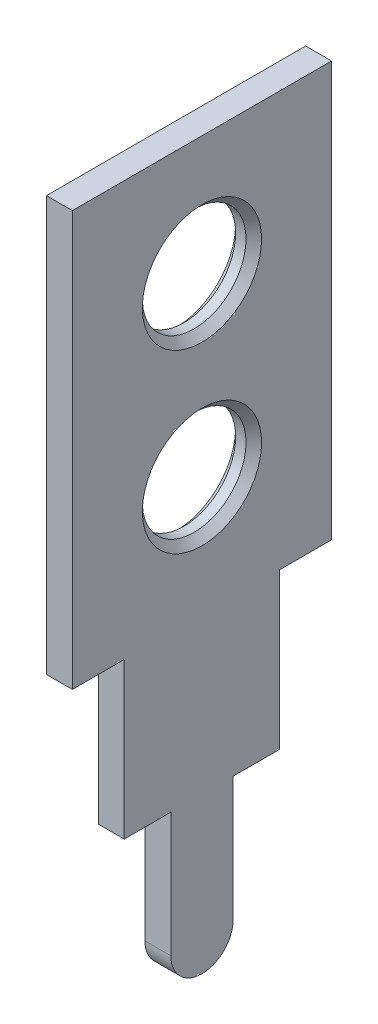
ISO-10303-21;
HEADER;
FILE_DESCRIPTION(('STEP AP214'),'2;1');
FILE_NAME('part.step','',(''),(''),'','','');
FILE_SCHEMA(('AUTOMOTIVE_DESIGN { 1 0 10303 214 1 1 1 1 }'));
ENDSEC;
DATA;
#1=APPLICATION_CONTEXT('core data for automotive mechanical design processes');
#2=APPLICATION_PROTOCOL_DEFINITION('international standard','automotive_design',2000,#1);
#3=PRODUCT_CONTEXT('',#1,'mechanical');
#4=PRODUCT('Part','Part','',(#3));
#5=PRODUCT_RELATED_PRODUCT_CATEGORY('part','',(#4));
#6=PRODUCT_DEFINITION_FORMATION('','',#4);
#7=PRODUCT_DEFINITION_CONTEXT('part definition',#1,'design');
#8=PRODUCT_DEFINITION('design','',#6,#7);
#9=PRODUCT_DEFINITION_SHAPE('','',#8);
#10=(LENGTH_UNIT() NAMED_UNIT(*) SI_UNIT(.MILLI.,.METRE.));
#11=(NAMED_UNIT(*) PLANE_ANGLE_UNIT() SI_UNIT($,.RADIAN.));
#12=(NAMED_UNIT(*) SI_UNIT($,.STERADIAN.) SOLID_ANGLE_UNIT());
#13=UNCERTAINTY_MEASURE_WITH_UNIT(LENGTH_MEASURE(1.E-05),#10,'distance_accuracy_value','');
#14=(GEOMETRIC_REPRESENTATION_CONTEXT(3) GLOBAL_UNCERTAINTY_ASSIGNED_CONTEXT((#13)) GLOBAL_UNIT_ASSIGNED_CONTEXT((#10,
#11,#12)) REPRESENTATION_CONTEXT('',''));
#15=CARTESIAN_POINT('',(0.,0.,0.));
#16=DIRECTION('',(0.,0.,1.));
#17=DIRECTION('',(1.,0.,0.));
#18=AXIS2_PLACEMENT_3D('',#15,#16,#17);
#19=CARTESIAN_POINT('',(-0.249999999880401,8.7,0.));
#20=DIRECTION('',(-1.,0.,0.));
#21=DIRECTION('',(0.,0.,1.));
#22=AXIS2_PLACEMENT_3D('',#19,#20,#21);
#23=CONICAL_SURFACE('',#22,1.1499999999387,0.785398163397448);
#24=CARTESIAN_POINT('',(-0.0999999999999957,8.7,0.));
#25=DIRECTION('',(1.,0.,0.));
#26=DIRECTION('',(0.,0.,-1.));
#27=AXIS2_PLACEMENT_3D('',#24,#25,#26);
#28=CIRCLE('',#27,1.);
#29=CARTESIAN_POINT('',(-0.0999999999999957,8.7,-1.));
#30=VERTEX_POINT('',#29);
#31=EDGE_CURVE('E281',#30,#30,#28,.T.);
#32=ORIENTED_EDGE('',*,*,#31,.T.);
#33=EDGE_LOOP('',(#32));
#34=FACE_BOUND('',#33,.T.);
#35=CARTESIAN_POINT('',(-0.249999999994088,8.7,0.));
#36=DIRECTION('',(-1.,0.,0.));
#37=DIRECTION('',(0.,0.,1.));
#38=AXIS2_PLACEMENT_3D('',#35,#36,#37);
#39=CIRCLE('',#38,1.15000000005239);
#40=CARTESIAN_POINT('',(-0.249999999994088,8.7,1.15000000005239));
#41=VERTEX_POINT('',#40);
#42=EDGE_CURVE('E20',#41,#41,#39,.F.);
#43=ORIENTED_EDGE('',*,*,#42,.F.);
#44=EDGE_LOOP('',(#43));
#45=FACE_BOUND('',#44,.T.);
#46=ADVANCED_FACE('F17',(#34,#45),#23,.F.);
#47=CARTESIAN_POINT('',(-0.250000000050932,5.3,0.));
#48=DIRECTION('',(-1.,0.,0.));
#49=DIRECTION('',(0.,0.,1.));
#50=AXIS2_PLACEMENT_3D('',#47,#48,#49);
#51=CONICAL_SURFACE('',#50,1.14999999999554,0.78539816320797);
#52=CARTESIAN_POINT('',(-0.100000000000003,5.3,0.));
#53=DIRECTION('',(1.,0.,0.));
#54=DIRECTION('',(0.,0.,-1.));
#55=AXIS2_PLACEMENT_3D('',#52,#53,#54);
#56=CIRCLE('',#55,1.);
#57=CARTESIAN_POINT('',(-0.100000000000003,5.3,-1.));
#58=VERTEX_POINT('',#57);
#59=EDGE_CURVE('E284',#58,#58,#56,.T.);
#60=ORIENTED_EDGE('',*,*,#59,.T.);
#61=EDGE_LOOP('',(#60));
#62=FACE_BOUND('',#61,.T.);
#63=CARTESIAN_POINT('',(-0.250000000050932,5.3,0.));
#64=DIRECTION('',(-1.,0.,0.));
#65=DIRECTION('',(0.,0.,1.));
#66=AXIS2_PLACEMENT_3D('',#63,#64,#65);
#67=CIRCLE('',#66,1.14999999999554);
#68=CARTESIAN_POINT('',(-0.250000000050932,5.3,1.14999999999554));
#69=VERTEX_POINT('',#68);
#70=EDGE_CURVE('E280',#69,#69,#67,.F.);
#71=ORIENTED_EDGE('',*,*,#70,.F.);
#72=EDGE_LOOP('',(#71));
#73=FACE_BOUND('',#72,.T.);
#74=ADVANCED_FACE('F298',(#62,#73),#51,.F.);
#75=CARTESIAN_POINT('',(-0.25,5.3,0.));
#76=DIRECTION('',(1.,0.,0.));
#77=DIRECTION('',(0.,0.,-1.));
#78=AXIS2_PLACEMENT_3D('',#75,#76,#77);
#79=CYLINDRICAL_SURFACE('',#78,1.);
#80=CARTESIAN_POINT('',(0.0999999999748979,5.3,0.));
#81=DIRECTION('',(1.,0.,0.));
#82=DIRECTION('',(0.,0.,-1.));
#83=AXIS2_PLACEMENT_3D('',#80,#81,#82);
#84=CIRCLE('',#83,0.999999999976353);
#85=CARTESIAN_POINT('',(0.0999999999748979,5.3,-0.999999999976353));
#86=VERTEX_POINT('',#85);
#87=EDGE_CURVE('E277',#86,#86,#84,.T.);
#88=ORIENTED_EDGE('',*,*,#87,.T.);
#89=EDGE_LOOP('',(#88));
#90=FACE_BOUND('',#89,.T.);
#91=ORIENTED_EDGE('',*,*,#59,.F.);
#92=EDGE_LOOP('',(#91));
#93=FACE_BOUND('',#92,.T.);
#94=ADVANCED_FACE('F304',(#90,#93),#79,.F.);
#95=CARTESIAN_POINT('',(-0.25,8.7,0.));
#96=DIRECTION('',(1.,0.,0.));
#97=DIRECTION('',(0.,0.,-1.));
#98=AXIS2_PLACEMENT_3D('',#95,#96,#97);
#99=CYLINDRICAL_SURFACE('',#98,1.);
#100=CARTESIAN_POINT('',(0.100000000031741,8.7,0.));
#101=DIRECTION('',(1.,0.,0.));
#102=DIRECTION('',(0.,0.,-1.));
#103=AXIS2_PLACEMENT_3D('',#100,#101,#102);
#104=CIRCLE('',#103,0.999999999976353);
#105=CARTESIAN_POINT('',(0.100000000031741,8.7,-0.999999999976353));
#106=VERTEX_POINT('',#105);
#107=EDGE_CURVE('E242',#106,#106,#104,.T.);
#108=ORIENTED_EDGE('',*,*,#107,.T.);
#109=EDGE_LOOP('',(#108));
#110=FACE_BOUND('',#109,.T.);
#111=ORIENTED_EDGE('',*,*,#31,.F.);
#112=EDGE_LOOP('',(#111));
#113=FACE_BOUND('',#112,.T.);
#114=ADVANCED_FACE('F364',(#110,#113),#99,.F.);
#115=CARTESIAN_POINT('',(-0.25,-2.4,0.));
#116=DIRECTION('',(-1.,0.,0.));
#117=DIRECTION('',(0.,0.,1.));
#118=AXIS2_PLACEMENT_3D('',#115,#116,#117);
#119=PLANE('',#118);
#120=DIRECTION('',(0.,0.,1.));
#121=VECTOR('',#120,1.);
#122=CARTESIAN_POINT('',(-0.25,0.,-0.600000000000003));
#123=LINE('',#122,#121);
#124=CARTESIAN_POINT('',(-0.25,0.,-1.5));
#125=VERTEX_POINT('',#124);
#126=CARTESIAN_POINT('',(-0.25,0.,-0.599999999999994));
#127=VERTEX_POINT('',#126);
#128=EDGE_CURVE('E62',#125,#127,#123,.T.);
#129=ORIENTED_EDGE('',*,*,#128,.T.);
#130=DIRECTION('',(0.,-1.,0.));
#131=VECTOR('',#130,1.);
#132=CARTESIAN_POINT('',(-0.25,-2.4,-0.599999999999989));
#133=LINE('',#132,#131);
#134=CARTESIAN_POINT('',(-0.25,-2.4,-0.599999999999995));
#135=VERTEX_POINT('',#134);
#136=EDGE_CURVE('E150',#127,#135,#133,.T.);
#137=ORIENTED_EDGE('',*,*,#136,.T.);
#138=CARTESIAN_POINT('',(-0.25,-2.4,0.));
#139=DIRECTION('',(-1.,0.,0.));
#140=DIRECTION('',(0.,0.,1.));
#141=AXIS2_PLACEMENT_3D('',#138,#139,#140);
#142=CIRCLE('',#141,0.600000000000001);
#143=CARTESIAN_POINT('',(-0.25,-2.4,0.600000000000002));
#144=VERTEX_POINT('',#143);
#145=EDGE_CURVE('E145',#144,#135,#142,.F.);
#146=ORIENTED_EDGE('',*,*,#145,.F.);
#147=DIRECTION('',(0.,1.,0.));
#148=VECTOR('',#147,1.);
#149=CARTESIAN_POINT('',(-0.25,-2.4,0.600000000000003));
#150=LINE('',#149,#148);
#151=CARTESIAN_POINT('',(-0.25,0.,0.600000000000003));
#152=VERTEX_POINT('',#151);
#153=EDGE_CURVE('E53',#144,#152,#150,.T.);
#154=ORIENTED_EDGE('',*,*,#153,.T.);
#155=DIRECTION('',(0.,0.,1.));
#156=VECTOR('',#155,1.);
#157=CARTESIAN_POINT('',(-0.25,0.,0.600000000000003));
#158=LINE('',#157,#156);
#159=CARTESIAN_POINT('',(-0.25,0.,1.5));
#160=VERTEX_POINT('',#159);
#161=EDGE_CURVE('E118',#152,#160,#158,.T.);
#162=ORIENTED_EDGE('',*,*,#161,.T.);
#163=DIRECTION('',(0.,1.,0.));
#164=VECTOR('',#163,1.);
#165=CARTESIAN_POINT('',(-0.25,0.,1.5));
#166=LINE('',#165,#164);
#167=CARTESIAN_POINT('',(-0.25,3.,1.5));
#168=VERTEX_POINT('',#167);
#169=EDGE_CURVE('E227',#160,#168,#166,.T.);
#170=ORIENTED_EDGE('',*,*,#169,.T.);
#171=DIRECTION('',(0.,0.,1.));
#172=VECTOR('',#171,1.);
#173=CARTESIAN_POINT('',(-0.25,3.,1.5));
#174=LINE('',#173,#172);
#175=CARTESIAN_POINT('',(-0.25,3.,2.5));
#176=VERTEX_POINT('',#175);
#177=EDGE_CURVE('E217',#168,#176,#174,.T.);
#178=ORIENTED_EDGE('',*,*,#177,.T.);
#179=DIRECTION('',(0.,1.,0.));
#180=VECTOR('',#179,1.);
#181=CARTESIAN_POINT('',(-0.25,3.,2.5));
#182=LINE('',#181,#180);
#183=CARTESIAN_POINT('',(-0.25,11.,2.5));
#184=VERTEX_POINT('',#183);
#185=EDGE_CURVE('E206',#176,#184,#182,.T.);
#186=ORIENTED_EDGE('',*,*,#185,.T.);
#187=DIRECTION('',(0.,0.,1.));
#188=VECTOR('',#187,1.);
#189=CARTESIAN_POINT('',(-0.25,11.,-2.5));
#190=LINE('',#189,#188);
#191=CARTESIAN_POINT('',(-0.25,11.,-2.5));
#192=VERTEX_POINT('',#191);
#193=EDGE_CURVE('E195',#184,#192,#190,.F.);
#194=ORIENTED_EDGE('',*,*,#193,.T.);
#195=DIRECTION('',(0.,1.,0.));
#196=VECTOR('',#195,1.);
#197=CARTESIAN_POINT('',(-0.25,3.,-2.5));
#198=LINE('',#197,#196);
#199=CARTESIAN_POINT('',(-0.25,3.,-2.5));
#200=VERTEX_POINT('',#199);
#201=EDGE_CURVE('E184',#192,#200,#198,.F.);
#202=ORIENTED_EDGE('',*,*,#201,.T.);
#203=DIRECTION('',(0.,0.,1.));
#204=VECTOR('',#203,1.);
#205=CARTESIAN_POINT('',(-0.25,3.,-1.5));
#206=LINE('',#205,#204);
#207=CARTESIAN_POINT('',(-0.25,3.,-1.5));
#208=VERTEX_POINT('',#207);
#209=EDGE_CURVE('E173',#200,#208,#206,.T.);
#210=ORIENTED_EDGE('',*,*,#209,.T.);
#211=DIRECTION('',(0.,1.,0.));
#212=VECTOR('',#211,1.);
#213=CARTESIAN_POINT('',(-0.25,0.,-1.5));
#214=LINE('',#213,#212);
#215=EDGE_CURVE('E162',#208,#125,#214,.F.);
#216=ORIENTED_EDGE('',*,*,#215,.T.);
#217=EDGE_LOOP('',(#129,#137,#146,#154,#162,#170,#178,#186,#194,#202,#210,#216));
#218=FACE_BOUND('',#217,.T.);
#219=ORIENTED_EDGE('',*,*,#70,.T.);
#220=EDGE_LOOP('',(#219));
#221=FACE_BOUND('',#220,.T.);
#222=ORIENTED_EDGE('',*,*,#42,.T.);
#223=EDGE_LOOP('',(#222));
#224=FACE_BOUND('',#223,.T.);
#225=ADVANCED_FACE('F295',(#218,#221,#224),#119,.T.);
#226=CARTESIAN_POINT('',(0.249999999937245,5.3,0.));
#227=DIRECTION('',(1.,0.,0.));
#228=DIRECTION('',(0.,0.,-1.));
#229=AXIS2_PLACEMENT_3D('',#226,#227,#228);
#230=CONICAL_SURFACE('',#229,1.14999999999554,0.785398163586926);
#231=CARTESIAN_POINT('',(0.249999999937245,5.3,0.));
#232=DIRECTION('',(1.,0.,0.));
#233=DIRECTION('',(0.,0.,-1.));
#234=AXIS2_PLACEMENT_3D('',#231,#232,#233);
#235=CIRCLE('',#234,1.14999999999554);
#236=CARTESIAN_POINT('',(0.249999999937245,5.3,-1.14999999999554));
#237=VERTEX_POINT('',#236);
#238=EDGE_CURVE('E136',#237,#237,#235,.T.);
#239=ORIENTED_EDGE('',*,*,#238,.T.);
#240=EDGE_LOOP('',(#239));
#241=FACE_BOUND('',#240,.T.);
#242=ORIENTED_EDGE('',*,*,#87,.F.);
#243=EDGE_LOOP('',(#242));
#244=FACE_BOUND('',#243,.T.);
#245=ADVANCED_FACE('F357',(#241,#244),#230,.F.);
#246=CARTESIAN_POINT('',(0.249999999994088,8.7,0.));
#247=DIRECTION('',(1.,0.,0.));
#248=DIRECTION('',(0.,0.,-1.));
#249=AXIS2_PLACEMENT_3D('',#246,#247,#248);
#250=CONICAL_SURFACE('',#249,1.14999999999554,0.785398163586926);
#251=CARTESIAN_POINT('',(0.249999999994088,8.7,0.));
#252=DIRECTION('',(1.,0.,0.));
#253=DIRECTION('',(0.,0.,-1.));
#254=AXIS2_PLACEMENT_3D('',#251,#252,#253);
#255=CIRCLE('',#254,1.14999999999554);
#256=CARTESIAN_POINT('',(0.249999999994088,8.7,-1.14999999999554));
#257=VERTEX_POINT('',#256);
#258=EDGE_CURVE('E133',#257,#257,#255,.T.);
#259=ORIENTED_EDGE('',*,*,#258,.T.);
#260=EDGE_LOOP('',(#259));
#261=FACE_BOUND('',#260,.T.);
#262=ORIENTED_EDGE('',*,*,#107,.F.);
#263=EDGE_LOOP('',(#262));
#264=FACE_BOUND('',#263,.T.);
#265=ADVANCED_FACE('F354',(#261,#264),#250,.F.);
#266=CARTESIAN_POINT('',(0.25,-2.4,0.600000000000003));
#267=DIRECTION('',(0.,0.,-1.));
#268=DIRECTION('',(0.,1.,0.));
#269=AXIS2_PLACEMENT_3D('',#266,#267,#268);
#270=PLANE('',#269);
#271=DIRECTION('',(-1.,0.,0.));
#272=VECTOR('',#271,1.);
#273=CARTESIAN_POINT('',(0.25,-2.4,0.600000000000001));
#274=LINE('',#273,#272);
#275=CARTESIAN_POINT('',(0.25,-2.4,0.600000000000002));
#276=VERTEX_POINT('',#275);
#277=EDGE_CURVE('E132',#276,#144,#274,.T.);
#278=ORIENTED_EDGE('',*,*,#277,.F.);
#279=DIRECTION('',(0.,1.,0.));
#280=VECTOR('',#279,1.);
#281=CARTESIAN_POINT('',(0.25,-2.4,0.600000000000003));
#282=LINE('',#281,#280);
#283=CARTESIAN_POINT('',(0.25,0.,0.600000000000003));
#284=VERTEX_POINT('',#283);
#285=EDGE_CURVE('E126',#276,#284,#282,.T.);
#286=ORIENTED_EDGE('',*,*,#285,.T.);
#287=DIRECTION('',(-1.,0.,0.));
#288=VECTOR('',#287,1.);
#289=CARTESIAN_POINT('',(0.25,0.,0.600000000000003));
#290=LINE('',#289,#288);
#291=EDGE_CURVE('E113',#284,#152,#290,.T.);
#292=ORIENTED_EDGE('',*,*,#291,.T.);
#293=ORIENTED_EDGE('',*,*,#153,.F.);
#294=EDGE_LOOP('',(#278,#286,#292,#293));
#295=FACE_BOUND('',#294,.T.);
#296=ADVANCED_FACE('F131',(#295),#270,.F.);
#297=CARTESIAN_POINT('',(0.25,0.,0.600000000000003));
#298=DIRECTION('',(0.,1.,0.));
#299=DIRECTION('',(-1.,0.,0.));
#300=AXIS2_PLACEMENT_3D('',#297,#298,#299);
#301=PLANE('',#300);
#302=ORIENTED_EDGE('',*,*,#291,.F.);
#303=DIRECTION('',(0.,0.,1.));
#304=VECTOR('',#303,1.);
#305=CARTESIAN_POINT('',(0.25,0.,0.));
#306=LINE('',#305,#304);
#307=CARTESIAN_POINT('',(0.25,0.,1.5));
#308=VERTEX_POINT('',#307);
#309=EDGE_CURVE('E117',#284,#308,#306,.T.);
#310=ORIENTED_EDGE('',*,*,#309,.T.);
#311=DIRECTION('',(-1.,0.,0.));
#312=VECTOR('',#311,1.);
#313=CARTESIAN_POINT('',(0.25,0.,1.5));
#314=LINE('',#313,#312);
#315=EDGE_CURVE('E233',#308,#160,#314,.T.);
#316=ORIENTED_EDGE('',*,*,#315,.T.);
#317=ORIENTED_EDGE('',*,*,#161,.F.);
#318=EDGE_LOOP('',(#302,#310,#316,#317));
#319=FACE_BOUND('',#318,.T.);
#320=ADVANCED_FACE('F115',(#319),#301,.F.);
#321=CARTESIAN_POINT('',(0.25,0.,1.5));
#322=DIRECTION('',(0.,0.,-1.));
#323=DIRECTION('',(-1.,0.,0.));
#324=AXIS2_PLACEMENT_3D('',#321,#322,#323);
#325=PLANE('',#324);
#326=ORIENTED_EDGE('',*,*,#315,.F.);
#327=DIRECTION('',(0.,1.,0.));
#328=VECTOR('',#327,1.);
#329=CARTESIAN_POINT('',(0.25,-2.4,1.5));
#330=LINE('',#329,#328);
#331=CARTESIAN_POINT('',(0.25,3.,1.5));
#332=VERTEX_POINT('',#331);
#333=EDGE_CURVE('E129',#308,#332,#330,.T.);
#334=ORIENTED_EDGE('',*,*,#333,.T.);
#335=DIRECTION('',(1.,0.,0.));
#336=VECTOR('',#335,1.);
#337=CARTESIAN_POINT('',(0.25,3.,1.5));
#338=LINE('',#337,#336);
#339=EDGE_CURVE('E224',#332,#168,#338,.F.);
#340=ORIENTED_EDGE('',*,*,#339,.T.);
#341=ORIENTED_EDGE('',*,*,#169,.F.);
#342=EDGE_LOOP('',(#326,#334,#340,#341));
#343=FACE_BOUND('',#342,.T.);
#344=ADVANCED_FACE('F345',(#343),#325,.F.);
#345=CARTESIAN_POINT('',(0.25,3.,1.5));
#346=DIRECTION('',(0.,1.,0.));
#347=DIRECTION('',(0.,0.,1.));
#348=AXIS2_PLACEMENT_3D('',#345,#346,#347);
#349=PLANE('',#348);
#350=ORIENTED_EDGE('',*,*,#339,.F.);
#351=DIRECTION('',(0.,0.,1.));
#352=VECTOR('',#351,1.);
#353=CARTESIAN_POINT('',(0.25,3.,0.));
#354=LINE('',#353,#352);
#355=CARTESIAN_POINT('',(0.25,3.,2.5));
#356=VERTEX_POINT('',#355);
#357=EDGE_CURVE('E211',#332,#356,#354,.T.);
#358=ORIENTED_EDGE('',*,*,#357,.T.);
#359=DIRECTION('',(1.,0.,0.));
#360=VECTOR('',#359,1.);
#361=CARTESIAN_POINT('',(0.25,3.,2.5));
#362=LINE('',#361,#360);
#363=EDGE_CURVE('E214',#356,#176,#362,.F.);
#364=ORIENTED_EDGE('',*,*,#363,.T.);
#365=ORIENTED_EDGE('',*,*,#177,.F.);
#366=EDGE_LOOP('',(#350,#358,#364,#365));
#367=FACE_BOUND('',#366,.T.);
#368=ADVANCED_FACE('F341',(#367),#349,.F.);
#369=CARTESIAN_POINT('',(0.25,3.,2.5));
#370=DIRECTION('',(0.,0.,-1.));
#371=DIRECTION('',(0.,1.,0.));
#372=AXIS2_PLACEMENT_3D('',#369,#370,#371);
#373=PLANE('',#372);
#374=ORIENTED_EDGE('',*,*,#363,.F.);
#375=DIRECTION('',(0.,1.,0.));
#376=VECTOR('',#375,1.);
#377=CARTESIAN_POINT('',(0.25,-2.4,2.5));
#378=LINE('',#377,#376);
#379=CARTESIAN_POINT('',(0.25,11.,2.5));
#380=VERTEX_POINT('',#379);
#381=EDGE_CURVE('E200',#356,#380,#378,.T.);
#382=ORIENTED_EDGE('',*,*,#381,.T.);
#383=DIRECTION('',(1.,0.,0.));
#384=VECTOR('',#383,1.);
#385=CARTESIAN_POINT('',(0.25,11.,2.5));
#386=LINE('',#385,#384);
#387=EDGE_CURVE('E203',#380,#184,#386,.F.);
#388=ORIENTED_EDGE('',*,*,#387,.T.);
#389=ORIENTED_EDGE('',*,*,#185,.F.);
#390=EDGE_LOOP('',(#374,#382,#388,#389));
#391=FACE_BOUND('',#390,.T.);
#392=ADVANCED_FACE('F337',(#391),#373,.F.);
#393=CARTESIAN_POINT('',(0.25,11.,-2.5));
#394=DIRECTION('',(0.,-1.,0.));
#395=DIRECTION('',(1.,0.,0.));
#396=AXIS2_PLACEMENT_3D('',#393,#394,#395);
#397=PLANE('',#396);
#398=ORIENTED_EDGE('',*,*,#387,.F.);
#399=DIRECTION('',(0.,0.,1.));
#400=VECTOR('',#399,1.);
#401=CARTESIAN_POINT('',(0.25,11.,0.));
#402=LINE('',#401,#400);
#403=CARTESIAN_POINT('',(0.25,11.,-2.5));
#404=VERTEX_POINT('',#403);
#405=EDGE_CURVE('E189',#380,#404,#402,.F.);
#406=ORIENTED_EDGE('',*,*,#405,.T.);
#407=DIRECTION('',(1.,0.,0.));
#408=VECTOR('',#407,1.);
#409=CARTESIAN_POINT('',(0.25,11.,-2.5));
#410=LINE('',#409,#408);
#411=EDGE_CURVE('E192',#404,#192,#410,.F.);
#412=ORIENTED_EDGE('',*,*,#411,.T.);
#413=ORIENTED_EDGE('',*,*,#193,.F.);
#414=EDGE_LOOP('',(#398,#406,#412,#413));
#415=FACE_BOUND('',#414,.T.);
#416=ADVANCED_FACE('F333',(#415),#397,.F.);
#417=CARTESIAN_POINT('',(0.25,3.,-2.5));
#418=DIRECTION('',(0.,0.,1.));
#419=DIRECTION('',(1.,0.,0.));
#420=AXIS2_PLACEMENT_3D('',#417,#418,#419);
#421=PLANE('',#420);
#422=ORIENTED_EDGE('',*,*,#411,.F.);
#423=DIRECTION('',(0.,1.,0.));
#424=VECTOR('',#423,1.);
#425=CARTESIAN_POINT('',(0.25,-2.4,-2.5));
#426=LINE('',#425,#424);
#427=CARTESIAN_POINT('',(0.25,3.,-2.5));
#428=VERTEX_POINT('',#427);
#429=EDGE_CURVE('E178',#404,#428,#426,.F.);
#430=ORIENTED_EDGE('',*,*,#429,.T.);
#431=DIRECTION('',(-1.,0.,0.));
#432=VECTOR('',#431,1.);
#433=CARTESIAN_POINT('',(0.25,3.,-2.5));
#434=LINE('',#433,#432);
#435=EDGE_CURVE('E181',#428,#200,#434,.T.);
#436=ORIENTED_EDGE('',*,*,#435,.T.);
#437=ORIENTED_EDGE('',*,*,#201,.F.);
#438=EDGE_LOOP('',(#422,#430,#436,#437));
#439=FACE_BOUND('',#438,.T.);
#440=ADVANCED_FACE('F329',(#439),#421,.F.);
#441=CARTESIAN_POINT('',(0.25,3.,-1.5));
#442=DIRECTION('',(0.,1.,0.));
#443=DIRECTION('',(-1.,0.,0.));
#444=AXIS2_PLACEMENT_3D('',#441,#442,#443);
#445=PLANE('',#444);
#446=ORIENTED_EDGE('',*,*,#435,.F.);
#447=DIRECTION('',(0.,0.,1.));
#448=VECTOR('',#447,1.);
#449=CARTESIAN_POINT('',(0.25,3.,0.));
#450=LINE('',#449,#448);
#451=CARTESIAN_POINT('',(0.25,3.,-1.5));
#452=VERTEX_POINT('',#451);
#453=EDGE_CURVE('E167',#428,#452,#450,.T.);
#454=ORIENTED_EDGE('',*,*,#453,.T.);
#455=DIRECTION('',(1.,0.,0.));
#456=VECTOR('',#455,1.);
#457=CARTESIAN_POINT('',(0.25,3.,-1.5));
#458=LINE('',#457,#456);
#459=EDGE_CURVE('E170',#452,#208,#458,.F.);
#460=ORIENTED_EDGE('',*,*,#459,.T.);
#461=ORIENTED_EDGE('',*,*,#209,.F.);
#462=EDGE_LOOP('',(#446,#454,#460,#461));
#463=FACE_BOUND('',#462,.T.);
#464=ADVANCED_FACE('F325',(#463),#445,.F.);
#465=CARTESIAN_POINT('',(0.25,0.,-1.5));
#466=DIRECTION('',(0.,0.,1.));
#467=DIRECTION('',(1.,0.,0.));
#468=AXIS2_PLACEMENT_3D('',#465,#466,#467);
#469=PLANE('',#468);
#470=ORIENTED_EDGE('',*,*,#459,.F.);
#471=DIRECTION('',(0.,1.,0.));
#472=VECTOR('',#471,1.);
#473=CARTESIAN_POINT('',(0.25,-2.4,-1.5));
#474=LINE('',#473,#472);
#475=CARTESIAN_POINT('',(0.25,0.,-1.5));
#476=VERTEX_POINT('',#475);
#477=EDGE_CURVE('E156',#452,#476,#474,.F.);
#478=ORIENTED_EDGE('',*,*,#477,.T.);
#479=DIRECTION('',(-1.,0.,0.));
#480=VECTOR('',#479,1.);
#481=CARTESIAN_POINT('',(0.25,0.,-1.5));
#482=LINE('',#481,#480);
#483=EDGE_CURVE('E159',#476,#125,#482,.T.);
#484=ORIENTED_EDGE('',*,*,#483,.T.);
#485=ORIENTED_EDGE('',*,*,#215,.F.);
#486=EDGE_LOOP('',(#470,#478,#484,#485));
#487=FACE_BOUND('',#486,.T.);
#488=ADVANCED_FACE('F321',(#487),#469,.F.);
#489=CARTESIAN_POINT('',(0.25,0.,-0.600000000000003));
#490=DIRECTION('',(0.,1.,0.));
#491=DIRECTION('',(-1.,0.,0.));
#492=AXIS2_PLACEMENT_3D('',#489,#490,#491);
#493=PLANE('',#492);
#494=ORIENTED_EDGE('',*,*,#483,.F.);
#495=DIRECTION('',(0.,0.,1.));
#496=VECTOR('',#495,1.);
#497=CARTESIAN_POINT('',(0.25,0.,0.));
#498=LINE('',#497,#496);
#499=CARTESIAN_POINT('',(0.25,0.,-0.599999999999999));
#500=VERTEX_POINT('',#499);
#501=EDGE_CURVE('E153',#476,#500,#498,.T.);
#502=ORIENTED_EDGE('',*,*,#501,.T.);
#503=DIRECTION('',(1.,0.,0.));
#504=VECTOR('',#503,1.);
#505=CARTESIAN_POINT('',(0.25,0.,-0.599999999999989));
#506=LINE('',#505,#504);
#507=EDGE_CURVE('E147',#500,#127,#506,.F.);
#508=ORIENTED_EDGE('',*,*,#507,.T.);
#509=ORIENTED_EDGE('',*,*,#128,.F.);
#510=EDGE_LOOP('',(#494,#502,#508,#509));
#511=FACE_BOUND('',#510,.T.);
#512=ADVANCED_FACE('F317',(#511),#493,.F.);
#513=CARTESIAN_POINT('',(0.25,-2.4,-0.599999999999989));
#514=DIRECTION('',(0.,0.,1.));
#515=DIRECTION('',(0.,-1.,0.));
#516=AXIS2_PLACEMENT_3D('',#513,#514,#515);
#517=PLANE('',#516);
#518=ORIENTED_EDGE('',*,*,#507,.F.);
#519=DIRECTION('',(0.,1.,0.));
#520=VECTOR('',#519,1.);
#521=CARTESIAN_POINT('',(0.25,-2.4,-0.600000000000003));
#522=LINE('',#521,#520);
#523=CARTESIAN_POINT('',(0.25,-2.4,-0.600000000000002));
#524=VERTEX_POINT('',#523);
#525=EDGE_CURVE('E26',#500,#524,#522,.F.);
#526=ORIENTED_EDGE('',*,*,#525,.T.);
#527=DIRECTION('',(-1.,0.,0.));
#528=VECTOR('',#527,1.);
#529=CARTESIAN_POINT('',(0.25,-2.4,-0.600000000000001));
#530=LINE('',#529,#528);
#531=EDGE_CURVE('E34',#135,#524,#530,.F.);
#532=ORIENTED_EDGE('',*,*,#531,.F.);
#533=ORIENTED_EDGE('',*,*,#136,.F.);
#534=EDGE_LOOP('',(#518,#526,#532,#533));
#535=FACE_BOUND('',#534,.T.);
#536=ADVANCED_FACE('F312',(#535),#517,.F.);
#537=CARTESIAN_POINT('',(0.25,-2.4,0.));
#538=DIRECTION('',(-1.,0.,0.));
#539=DIRECTION('',(0.,0.,1.));
#540=AXIS2_PLACEMENT_3D('',#537,#538,#539);
#541=CYLINDRICAL_SURFACE('',#540,0.600000000000001);
#542=CARTESIAN_POINT('',(0.25,-2.4,0.));
#543=DIRECTION('',(-1.,0.,0.));
#544=DIRECTION('',(0.,0.,1.));
#545=AXIS2_PLACEMENT_3D('',#542,#543,#544);
#546=CIRCLE('',#545,0.600000000000001);
#547=EDGE_CURVE('E11',#524,#276,#546,.T.);
#548=ORIENTED_EDGE('',*,*,#547,.T.);
#549=ORIENTED_EDGE('',*,*,#277,.T.);
#550=ORIENTED_EDGE('',*,*,#145,.T.);
#551=ORIENTED_EDGE('',*,*,#531,.T.);
#552=EDGE_LOOP('',(#548,#549,#550,#551));
#553=FACE_BOUND('',#552,.T.);
#554=ADVANCED_FACE('F307',(#553),#541,.T.);
#555=CARTESIAN_POINT('',(0.25,-2.4,0.));
#556=DIRECTION('',(-1.,0.,0.));
#557=DIRECTION('',(0.,0.,1.));
#558=AXIS2_PLACEMENT_3D('',#555,#556,#557);
#559=PLANE('',#558);
#560=ORIENTED_EDGE('',*,*,#525,.F.);
#561=ORIENTED_EDGE('',*,*,#501,.F.);
#562=ORIENTED_EDGE('',*,*,#477,.F.);
#563=ORIENTED_EDGE('',*,*,#453,.F.);
#564=ORIENTED_EDGE('',*,*,#429,.F.);
#565=ORIENTED_EDGE('',*,*,#405,.F.);
#566=ORIENTED_EDGE('',*,*,#381,.F.);
#567=ORIENTED_EDGE('',*,*,#357,.F.);
#568=ORIENTED_EDGE('',*,*,#333,.F.);
#569=ORIENTED_EDGE('',*,*,#309,.F.);
#570=ORIENTED_EDGE('',*,*,#285,.F.);
#571=ORIENTED_EDGE('',*,*,#547,.F.);
#572=EDGE_LOOP('',(#560,#561,#562,#563,#564,#565,#566,#567,#568,#569,#570,#571));
#573=FACE_BOUND('',#572,.T.);
#574=ORIENTED_EDGE('',*,*,#258,.F.);
#575=EDGE_LOOP('',(#574));
#576=FACE_BOUND('',#575,.T.);
#577=ORIENTED_EDGE('',*,*,#238,.F.);
#578=EDGE_LOOP('',(#577));
#579=FACE_BOUND('',#578,.T.);
#580=ADVANCED_FACE('F124',(#573,#576,#579),#559,.F.);
#581=CLOSED_SHELL('',(#46,#74,#94,#114,#225,#245,#265,#296,#320,#344,#368,#392,#416,#440,#464,
#488,#512,#536,#554,#580));
#582=MANIFOLD_SOLID_BREP('B1',#581);
#583=ADVANCED_BREP_SHAPE_REPRESENTATION('',(#18,#582),#14);
#584=SHAPE_DEFINITION_REPRESENTATION(#9,#583);
ENDSEC;
END-ISO-10303-21;
